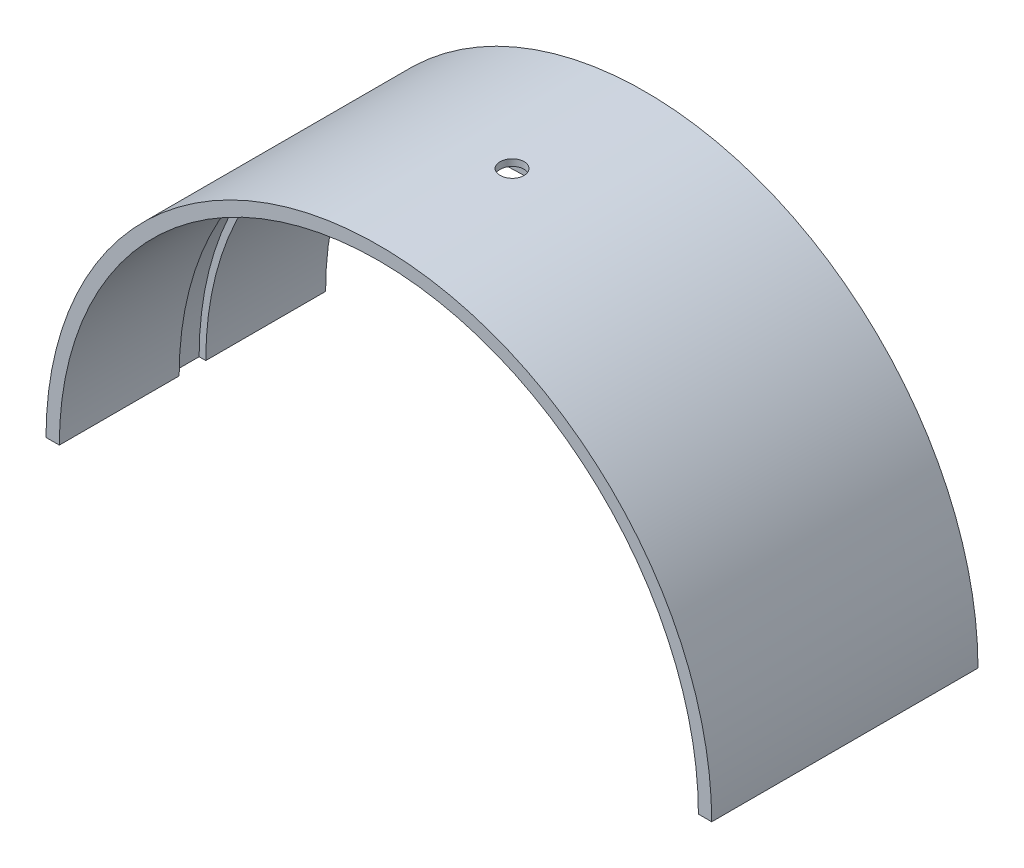
ISO-10303-21;
HEADER;
FILE_DESCRIPTION(('STEP AP214'),'2;1');
FILE_NAME('part.step','',(''),(''),'','','');
FILE_SCHEMA(('AUTOMOTIVE_DESIGN { 1 0 10303 214 1 1 1 1 }'));
ENDSEC;
DATA;
#1=APPLICATION_CONTEXT('core data for automotive mechanical design processes');
#2=APPLICATION_PROTOCOL_DEFINITION('international standard','automotive_design',2000,#1);
#3=PRODUCT_CONTEXT('',#1,'mechanical');
#4=PRODUCT('Part','Part','',(#3));
#5=PRODUCT_RELATED_PRODUCT_CATEGORY('part','',(#4));
#6=PRODUCT_DEFINITION_FORMATION('','',#4);
#7=PRODUCT_DEFINITION_CONTEXT('part definition',#1,'design');
#8=PRODUCT_DEFINITION('design','',#6,#7);
#9=PRODUCT_DEFINITION_SHAPE('','',#8);
#10=(LENGTH_UNIT() NAMED_UNIT(*) SI_UNIT(.MILLI.,.METRE.));
#11=(NAMED_UNIT(*) PLANE_ANGLE_UNIT() SI_UNIT($,.RADIAN.));
#12=(NAMED_UNIT(*) SI_UNIT($,.STERADIAN.) SOLID_ANGLE_UNIT());
#13=UNCERTAINTY_MEASURE_WITH_UNIT(LENGTH_MEASURE(1.E-05),#10,'distance_accuracy_value','');
#14=(GEOMETRIC_REPRESENTATION_CONTEXT(3) GLOBAL_UNCERTAINTY_ASSIGNED_CONTEXT((#13)) GLOBAL_UNIT_ASSIGNED_CONTEXT((#10,
#11,#12)) REPRESENTATION_CONTEXT('',''));
#15=CARTESIAN_POINT('',(0.,0.,0.));
#16=DIRECTION('',(0.,0.,1.));
#17=DIRECTION('',(1.,0.,0.));
#18=AXIS2_PLACEMENT_3D('',#15,#16,#17);
#19=CARTESIAN_POINT('',(0.,0.,-11.5257567109553));
#20=DIRECTION('',(0.,0.,-1.));
#21=DIRECTION('',(-1.,0.,0.));
#22=AXIS2_PLACEMENT_3D('',#19,#20,#21);
#23=CYLINDRICAL_SURFACE('',#22,24.5);
#24=CARTESIAN_POINT('',(0.,0.,0.999999999999997));
#25=DIRECTION('',(0.,0.,-1.));
#26=DIRECTION('',(-1.,0.,0.));
#27=AXIS2_PLACEMENT_3D('',#24,#25,#26);
#28=CIRCLE('',#27,24.5);
#29=CARTESIAN_POINT('',(-24.5,-1.71082585603314E-13,0.999999999999997));
#30=VERTEX_POINT('',#29);
#31=CARTESIAN_POINT('',(24.5,0.,0.999999999999997));
#32=VERTEX_POINT('',#31);
#33=EDGE_CURVE('E53',#30,#32,#28,.T.);
#34=ORIENTED_EDGE('',*,*,#33,.F.);
#35=DIRECTION('',(0.,0.,-1.));
#36=VECTOR('',#35,1.);
#37=CARTESIAN_POINT('',(-24.5,-1.71082585603314E-13,0.));
#38=LINE('',#37,#36);
#39=CARTESIAN_POINT('',(-24.5,-1.71082585603314E-13,-1.));
#40=VERTEX_POINT('',#39);
#41=EDGE_CURVE('E155',#30,#40,#38,.T.);
#42=ORIENTED_EDGE('',*,*,#41,.T.);
#43=CARTESIAN_POINT('',(0.,0.,-1.));
#44=DIRECTION('',(0.,0.,-1.));
#45=DIRECTION('',(-1.,0.,0.));
#46=AXIS2_PLACEMENT_3D('',#43,#44,#45);
#47=CIRCLE('',#46,24.5);
#48=CARTESIAN_POINT('',(24.5,0.,-1.));
#49=VERTEX_POINT('',#48);
#50=EDGE_CURVE('E60',#40,#49,#47,.T.);
#51=ORIENTED_EDGE('',*,*,#50,.T.);
#52=DIRECTION('',(0.,0.,-1.));
#53=VECTOR('',#52,1.);
#54=CARTESIAN_POINT('',(24.5,0.,0.));
#55=LINE('',#54,#53);
#56=EDGE_CURVE('E123',#32,#49,#55,.T.);
#57=ORIENTED_EDGE('',*,*,#56,.F.);
#58=EDGE_LOOP('',(#34,#42,#51,#57));
#59=FACE_BOUND('',#58,.T.);
#60=CARTESIAN_POINT('',(0.,24.5,-0.9));
#61=CARTESIAN_POINT('',(-0.0505351060782391,24.4999997777193,-0.899997764618985));
#62=CARTESIAN_POINT('',(-0.101106420724203,24.4998419685368,-0.895729382512844));
#63=CARTESIAN_POINT('',(-0.200855035460117,24.499227607288,-0.878761893636397));
#64=CARTESIAN_POINT('',(-0.250030604068245,24.4987706997461,-0.866052754840935));
#65=CARTESIAN_POINT('',(-0.345528266124883,24.4976098771127,-0.832567165531731));
#66=CARTESIAN_POINT('',(-0.391851758754188,24.4969060842924,-0.811794707878773));
#67=CARTESIAN_POINT('',(-0.480341370296564,24.4953308430445,-0.762777978781651));
#68=CARTESIAN_POINT('',(-0.522508491280468,24.4944594351779,-0.734535514379406));
#69=CARTESIAN_POINT('',(-0.601527041724291,24.4926464614145,-0.671360684171487));
#70=CARTESIAN_POINT('',(-0.638375665502354,24.491704858882,-0.636424809824677));
#71=CARTESIAN_POINT('',(-0.705687480975214,24.4898579404172,-0.560861395845723));
#72=CARTESIAN_POINT('',(-0.736150416552575,24.4889526259416,-0.52023362803188));
#73=CARTESIAN_POINT('',(-0.789832073100561,24.4872801553044,-0.434427275868664));
#74=CARTESIAN_POINT('',(-0.81304887440522,24.4865130357765,-0.389247489772304));
#75=CARTESIAN_POINT('',(-0.851566823368687,24.4852038483768,-0.295628103839328));
#76=CARTESIAN_POINT('',(-0.866868010713494,24.4846617793767,-0.247188520347521));
#77=CARTESIAN_POINT('',(-0.889113712393846,24.4838641141696,-0.148447914584213));
#78=CARTESIAN_POINT('',(-0.896062027972267,24.4836083876569,-0.0981477497807842));
#79=CARTESIAN_POINT('',(-0.901416467016089,24.4834118511139,0.00290563695993807));
#80=CARTESIAN_POINT('',(-0.899822633931691,24.4834710394818,0.0536588565914271));
#81=CARTESIAN_POINT('',(-0.888141209918508,24.4838975368855,0.154151859365249));
#82=CARTESIAN_POINT('',(-0.878057725236362,24.4842646969622,0.203892120542047));
#83=CARTESIAN_POINT('',(-0.849689587459662,24.4852655154777,0.300973429353913));
#84=CARTESIAN_POINT('',(-0.83140491163499,24.4858991746551,0.348314470338986));
#85=CARTESIAN_POINT('',(-0.787148718762686,24.4873617351961,0.43926672908332));
#86=CARTESIAN_POINT('',(-0.761175322276081,24.4881906842865,0.482877031533373));
#87=CARTESIAN_POINT('',(-0.702280362135567,24.4899503325209,0.565119848120088));
#88=CARTESIAN_POINT('',(-0.669358773284214,24.490881032034,0.603752344204044));
#89=CARTESIAN_POINT('',(-0.597478740517276,24.4927399316147,0.674966825318465));
#90=CARTESIAN_POINT('',(-0.558516737859195,24.4936681298786,0.707545218502961));
#91=CARTESIAN_POINT('',(-0.475674405472432,24.4954168654581,0.7656990514857));
#92=CARTESIAN_POINT('',(-0.431794074848379,24.4962374027542,0.791274490009069));
#93=CARTESIAN_POINT('',(-0.340358662170344,24.4976783434958,0.834696035773812));
#94=CARTESIAN_POINT('',(-0.292803524755661,24.4982987439255,0.85254202654485));
#95=CARTESIAN_POINT('',(-0.195369323657861,24.4992694331828,0.879995785473122));
#96=CARTESIAN_POINT('',(-0.145490269410039,24.4996197231071,0.889603587075014));
#97=CARTESIAN_POINT('',(-0.0448553230308331,24.5000105668965,0.90030382849252));
#98=CARTESIAN_POINT('',(0.00590004003000969,24.5000513015234,0.90140123787227));
#99=CARTESIAN_POINT('',(0.106874255094776,24.4998189223698,0.895062499128601));
#100=CARTESIAN_POINT('',(0.157093108043517,24.499545809142,0.887626366035625));
#101=CARTESIAN_POINT('',(0.25555489779959,24.4987166255881,0.864435740013489));
#102=CARTESIAN_POINT('',(0.303798367607939,24.4981606321401,0.848683507098701));
#103=CARTESIAN_POINT('',(0.396956315781612,24.4968283246329,0.809310121872092));
#104=CARTESIAN_POINT('',(0.441870783933728,24.496052009898,0.785688945419976));
#105=CARTESIAN_POINT('',(0.527118630317461,24.4943660278986,0.731235415126712));
#106=CARTESIAN_POINT('',(0.567449873222022,24.4934562989249,0.700399720335924));
#107=CARTESIAN_POINT('',(0.642364960123,24.4916062004816,0.632397364376701));
#108=CARTESIAN_POINT('',(0.676948783226594,24.4906658309007,0.595230680195063));
#109=CARTESIAN_POINT('',(0.739403957700735,24.4888599417767,0.515600051209842));
#110=CARTESIAN_POINT('',(0.767272100258646,24.4879944581409,0.473133588775546));
#111=CARTESIAN_POINT('',(0.815482908665854,24.4864364888819,0.384121671765032));
#112=CARTESIAN_POINT('',(0.835825595932535,24.4857440027664,0.337576228798025));
#113=CARTESIAN_POINT('',(0.868402421095069,24.4846103645958,0.241739631634666));
#114=CARTESIAN_POINT('',(0.880638626446128,24.4841691484615,0.192449180996761));
#115=CARTESIAN_POINT('',(0.896661918695542,24.4835876183772,0.0925118202634302));
#116=CARTESIAN_POINT('',(0.900449024383912,24.483447303758,0.0418649131848911));
#117=CARTESIAN_POINT('',(0.899466382713747,24.4834834202253,-0.0593156486842136));
#118=CARTESIAN_POINT('',(0.894701690063422,24.4836596642037,-0.109849352710204));
#119=CARTESIAN_POINT('',(0.876761119269286,24.4843086367024,-0.209399006958379));
#120=CARTESIAN_POINT('',(0.863585224604651,24.484781365805,-0.25841495419927));
#121=CARTESIAN_POINT('',(0.829197121319196,24.485969985683,-0.353539234715138));
#122=CARTESIAN_POINT('',(0.807984793438202,24.486685880067,-0.399647524828818));
#123=CARTESIAN_POINT('',(0.758127255735359,24.4882801031161,-0.487647831542547));
#124=CARTESIAN_POINT('',(0.729482303233341,24.4891584261576,-0.529539994036608));
#125=CARTESIAN_POINT('',(0.665556073380793,24.4909790575738,-0.607943161223141));
#126=CARTESIAN_POINT('',(0.630271590846078,24.4919213967107,-0.64445155169295));
#127=CARTESIAN_POINT('',(0.554064051327019,24.4937637478822,-0.711036953101924));
#128=CARTESIAN_POINT('',(0.513139602892659,24.4946637493979,-0.741112372259305));
#129=CARTESIAN_POINT('',(0.426793327767193,24.4963203812061,-0.793985699171462));
#130=CARTESIAN_POINT('',(0.381368219856142,24.4970769057078,-0.816778245411689));
#131=CARTESIAN_POINT('',(0.287368054038592,24.498359532988,-0.85438655980945));
#132=CARTESIAN_POINT('',(0.23879681986582,24.4988859096665,-0.869211814722354));
#133=CARTESIAN_POINT('',(0.158266803914834,24.4995086559252,-0.886547131982897));
#134=CARTESIAN_POINT('',(0.126830430064505,24.4996921076025,-0.891585583730774));
#135=CARTESIAN_POINT('',(0.0636008188793678,24.4999378495662,-0.898312720482534));
#136=CARTESIAN_POINT('',(0.0318075817040646,24.5000001399069,-0.900001406983576));
#137=CARTESIAN_POINT('',(0.,24.5,-0.9));
#138=B_SPLINE_CURVE_WITH_KNOTS('',3,(#60,#61,#62,#63,#64,#65,#66,#67,#68,#69,#70,#71,#72,#73,
#74,#75,#76,#77,#78,#79,#80,#81,#82,#83,#84,#85,#86,#87,#88,#89,#90,#91,#92,#93,#94,#95,#96,#97,
#98,#99,#100,#101,#102,#103,#104,#105,#106,#107,#108,#109,#110,#111,#112,#113,#114,#115,#116,
#117,#118,#119,#120,#121,#122,#123,#124,#125,#126,#127,#128,#129,#130,#131,#132,#133,#134,#135,
#136,#137),.UNSPECIFIED.,.T.,.F.,(4,2,2,2,2,2,2,2,2,2,2,2,2,2,2,2,2,2,2,2,2,2,2,2,2,2,2,2,2,2,2,
2,2,2,2,2,2,2,4),(0.,0.151489214279059,0.303158799800879,0.454753375939524,0.606311313877182,
0.757948913650054,0.909592594146601,1.06127641447353,1.21295947430577,1.36457347972142,
1.51618671394318,1.66772665847641,1.81926702301472,1.97084446087038,2.12242244842719,
2.27409008074402,2.42575774067162,2.57742768590722,2.72909701540396,2.88067777233702,
3.03225826228573,3.18379757934336,3.33533736129664,3.48694745873902,3.6385581072972,
3.79024105378945,3.94192356858998,4.09356738378506,4.24521086173798,4.39676473735314,
4.54831891064307,4.69987533307567,4.85142650927658,5.00305103425648,5.15471303409084,
5.30648642877394,5.45807870226744,5.55342841236032,5.64877807983714),.UNSPECIFIED.);
#139=CARTESIAN_POINT('',(0.,24.5,-0.9));
#140=VERTEX_POINT('',#139);
#141=EDGE_CURVE('E128',#140,#140,#138,.T.);
#142=ORIENTED_EDGE('',*,*,#141,.T.);
#143=EDGE_LOOP('',(#142));
#144=FACE_BOUND('',#143,.T.);
#145=ADVANCED_FACE('F39',(#59,#144),#23,.F.);
#146=CARTESIAN_POINT('',(0.,0.,-11.5257567109553));
#147=DIRECTION('',(0.,0.,-1.));
#148=DIRECTION('',(-1.,0.,0.));
#149=AXIS2_PLACEMENT_3D('',#146,#147,#148);
#150=CYLINDRICAL_SURFACE('',#149,25.);
#151=CARTESIAN_POINT('',(0.,0.,-10.));
#152=DIRECTION('',(0.,0.,-1.));
#153=DIRECTION('',(-1.,0.,0.));
#154=AXIS2_PLACEMENT_3D('',#151,#152,#153);
#155=CIRCLE('',#154,25.);
#156=CARTESIAN_POINT('',(-25.,-1.74574066942157E-13,-10.));
#157=VERTEX_POINT('',#156);
#158=CARTESIAN_POINT('',(25.,0.,-10.));
#159=VERTEX_POINT('',#158);
#160=EDGE_CURVE('E188',#157,#159,#155,.T.);
#161=ORIENTED_EDGE('',*,*,#160,.F.);
#162=DIRECTION('',(0.,0.,1.));
#163=VECTOR('',#162,1.);
#164=CARTESIAN_POINT('',(-25.,-1.74574066942157E-13,0.));
#165=LINE('',#164,#163);
#166=CARTESIAN_POINT('',(-25.,-1.74574066942157E-13,10.));
#167=VERTEX_POINT('',#166);
#168=EDGE_CURVE('E169',#157,#167,#165,.T.);
#169=ORIENTED_EDGE('',*,*,#168,.T.);
#170=CARTESIAN_POINT('',(0.,0.,10.));
#171=DIRECTION('',(0.,0.,-1.));
#172=DIRECTION('',(-1.,0.,0.));
#173=AXIS2_PLACEMENT_3D('',#170,#171,#172);
#174=CIRCLE('',#173,25.);
#175=CARTESIAN_POINT('',(25.,0.,10.));
#176=VERTEX_POINT('',#175);
#177=EDGE_CURVE('E191',#167,#176,#174,.T.);
#178=ORIENTED_EDGE('',*,*,#177,.T.);
#179=DIRECTION('',(0.,0.,1.));
#180=VECTOR('',#179,1.);
#181=CARTESIAN_POINT('',(25.,0.,0.));
#182=LINE('',#181,#180);
#183=EDGE_CURVE('E144',#159,#176,#182,.T.);
#184=ORIENTED_EDGE('',*,*,#183,.F.);
#185=EDGE_LOOP('',(#161,#169,#178,#184));
#186=FACE_BOUND('',#185,.T.);
#187=CARTESIAN_POINT('',(0.,25.,-0.9));
#188=CARTESIAN_POINT('',(0.0505358299575111,24.9999997821146,-0.899997764357591));
#189=CARTESIAN_POINT('',(0.101107886204852,24.9998451246391,-0.895729260451866));
#190=CARTESIAN_POINT('',(0.200858013351447,24.9992430331769,-0.878761259574586));
#191=CARTESIAN_POINT('',(0.250034351978575,24.998795250655,-0.866051725676573));
#192=CARTESIAN_POINT('',(0.345533557905941,24.9976576121728,-0.832565025231658));
#193=CARTESIAN_POINT('',(0.39185782247057,24.996967875876,-0.811791846189618));
#194=CARTESIAN_POINT('',(0.480348825067873,24.9954241009306,-0.76277335218435));
#195=CARTESIAN_POINT('',(0.522516566319998,24.9945701020761,-0.734529846352528));
#196=CARTESIAN_POINT('',(0.601535420471143,24.992793372449,-0.671353196972493));
#197=CARTESIAN_POINT('',(0.638383816447172,24.9918706069153,-0.636416655921973));
#198=CARTESIAN_POINT('',(0.705695009782056,24.9900606494127,-0.560851947562661));
#199=CARTESIAN_POINT('',(0.73615755123268,24.9891734588706,-0.520223552265973));
#200=CARTESIAN_POINT('',(0.789837938182272,24.9875344936121,-0.434416571778399));
#201=CARTESIAN_POINT('',(0.813053945584977,24.9867827532734,-0.389236835969661));
#202=CARTESIAN_POINT('',(0.851570367321573,24.9854998231692,-0.295617817866157));
#203=CARTESIAN_POINT('',(0.866870820397095,24.9849686323244,-0.247178551526045));
#204=CARTESIAN_POINT('',(0.889115403017304,24.9841869777321,-0.148437908786091));
#205=CARTESIAN_POINT('',(0.896063182768704,24.9839363913608,-0.0981373557018038));
#206=CARTESIAN_POINT('',(0.901416448483106,24.9837438327537,0.00291668969367428));
#207=CARTESIAN_POINT('',(0.899821976784824,24.9838018589883,0.0536701797586883));
#208=CARTESIAN_POINT('',(0.888139067220623,24.9842198679703,0.154164624005448));
#209=CARTESIAN_POINT('',(0.878054572670543,24.9845797105345,0.20390603727822));
#210=CARTESIAN_POINT('',(0.8496839828355,24.9855605683101,0.300989480445962));
#211=CARTESIAN_POINT('',(0.831397865374745,24.9861815842279,0.348331503853006));
#212=CARTESIAN_POINT('',(0.787138584095716,24.9876149471606,0.439285003008272));
#213=CARTESIAN_POINT('',(0.761163615103002,24.9884273390974,0.482895599596076));
#214=CARTESIAN_POINT('',(0.702265296005424,24.9901518306294,0.565138666128165));
#215=CARTESIAN_POINT('',(0.66934192181051,24.9910639305703,0.603771118812526));
#216=CARTESIAN_POINT('',(0.597459074243739,24.9928856456015,0.674984228080218));
#217=CARTESIAN_POINT('',(0.558496183141841,24.9937952589862,0.707561434934492));
#218=CARTESIAN_POINT('',(0.475652359994273,24.9955089649375,0.765712738710541));
#219=CARTESIAN_POINT('',(0.431771427065669,24.9963130574851,0.791286834375047));
#220=CARTESIAN_POINT('',(0.340335197237805,24.9977251006856,0.834705588948888));
#221=CARTESIAN_POINT('',(0.29277984736518,24.9983330485101,0.852550136398293));
#222=CARTESIAN_POINT('',(0.195345578500072,24.9992842304056,0.880001037052016));
#223=CARTESIAN_POINT('',(0.14546666857177,24.9996274655093,0.889607422390469));
#224=CARTESIAN_POINT('',(0.0448311307414574,25.0000104006701,0.900305075016805));
#225=CARTESIAN_POINT('',(-0.00592498917054738,25.0000502708673,0.901401115281439));
#226=CARTESIAN_POINT('',(-0.106900491218682,24.9998224330805,0.895059407795804));
#227=CARTESIAN_POINT('',(-0.157119874261571,24.9995547256163,0.887621674464737));
#228=CARTESIAN_POINT('',(-0.25558303287527,24.9987420084713,0.864427500246508));
#229=CARTESIAN_POINT('',(-0.303827320309746,24.998197071135,0.848673229559171));
#230=CARTESIAN_POINT('',(-0.396986537117233,24.9968912870011,0.809295388128882));
#231=CARTESIAN_POINT('',(-0.441901456694551,24.9961304395681,0.78567179423387));
#232=CARTESIAN_POINT('',(-0.527148923451362,24.9944780920711,0.731213620439007));
#233=CARTESIAN_POINT('',(-0.567479419373229,24.9935865339271,0.700375831339088));
#234=CARTESIAN_POINT('',(-0.642392596182118,24.9917734198405,0.632369345345544));
#235=CARTESIAN_POINT('',(-0.676975256913769,24.9908518637927,0.595200626252792));
#236=CARTESIAN_POINT('',(-0.739427060525725,24.9890821545523,0.515566890230258));
#237=CARTESIAN_POINT('',(-0.767293121780838,24.9882340351669,0.47309945572053));
#238=CARTESIAN_POINT('',(-0.815499648963938,24.9867073559729,0.384086081300572));
#239=CARTESIAN_POINT('',(-0.835840135779761,24.9860287956937,0.337540152710973));
#240=CARTESIAN_POINT('',(-0.868412726007746,24.9849179852326,0.24170261439681));
#241=CARTESIAN_POINT('',(-0.880646815933241,24.9844856747097,0.19241168056155));
#242=CARTESIAN_POINT('',(-0.89666583880174,24.9839159380231,0.0924737829478655));
#243=CARTESIAN_POINT('',(-0.900450789183601,24.9837785112507,0.0418268219684737));
#244=CARTESIAN_POINT('',(-0.899463868530838,24.9838140585843,-0.0593546784743515));
#245=CARTESIAN_POINT('',(-0.894696852396149,24.9839868565775,-0.109889265426613));
#246=CARTESIAN_POINT('',(-0.876751318545876,24.9846230038243,-0.209440309881037));
#247=CARTESIAN_POINT('',(-0.863572784289526,24.9850863536493,-0.25845676439768));
#248=CARTESIAN_POINT('',(-0.829179113282818,24.9862513412054,-0.35358164392861));
#249=CARTESIAN_POINT('',(-0.807963855236856,24.9869529825331,-0.399690025040058));
#250=CARTESIAN_POINT('',(-0.758100236851855,24.9885154321198,-0.487689972185059));
#251=CARTESIAN_POINT('',(-0.729452135203476,24.9893762348391,-0.529581684903974));
#252=CARTESIAN_POINT('',(-0.665520265833703,24.9911604969519,-0.607982379669272));
#253=CARTESIAN_POINT('',(-0.630233447226496,24.992083985028,-0.644488873070192));
#254=CARTESIAN_POINT('',(-0.554021581378666,24.9938894477835,-0.711070062268238));
#255=CARTESIAN_POINT('',(-0.51309514246935,24.994771412144,-0.741143165831196));
#256=CARTESIAN_POINT('',(-0.426745822875752,24.9963947970882,-0.794011211698385));
#257=CARTESIAN_POINT('',(-0.381319707298787,24.9971361154264,-0.816800867329719));
#258=CARTESIAN_POINT('',(-0.287318176228993,24.9983929187085,-0.854403306596549));
#259=CARTESIAN_POINT('',(-0.238746584932446,24.9989086721837,-0.869225580111627));
#260=CARTESIAN_POINT('',(-0.158224503224093,24.9995187407918,-0.886554375601815));
#261=CARTESIAN_POINT('',(-0.12679640493848,24.999698427448,-0.891590117517155));
#262=CARTESIAN_POINT('',(-0.0635836521312206,24.9999391255774,-0.898313632372805));
#263=CARTESIAN_POINT('',(-0.0317989977624168,25.0000001371015,-0.900001406748203));
#264=CARTESIAN_POINT('',(0.,25.,-0.9));
#265=B_SPLINE_CURVE_WITH_KNOTS('',3,(#187,#188,#189,#190,#191,#192,#193,#194,#195,#196,#197,
#198,#199,#200,#201,#202,#203,#204,#205,#206,#207,#208,#209,#210,#211,#212,#213,#214,#215,#216,
#217,#218,#219,#220,#221,#222,#223,#224,#225,#226,#227,#228,#229,#230,#231,#232,#233,#234,#235,
#236,#237,#238,#239,#240,#241,#242,#243,#244,#245,#246,#247,#248,#249,#250,#251,#252,#253,#254,
#255,#256,#257,#258,#259,#260,#261,#262,#263,#264),.UNSPECIFIED.,.T.,.F.,(4,2,2,2,2,2,2,2,2,2,2,
2,2,2,2,2,2,2,2,2,2,2,2,2,2,2,2,2,2,2,2,2,2,2,2,2,2,2,4),(0.,0.151491417505849,
0.303163291306592,0.454760258108646,0.606320545375005,0.757957972141804,0.909601474501192,
1.06128341030584,1.21296460371633,1.36457948671512,1.51619361825238,1.66773736920404,
1.81928152990669,1.97086129812668,2.12244159188085,2.27410797939034,2.42577439412844,
2.57744299582035,2.72911100590436,2.8806939477326,3.03227663343709,3.18381978318972,
3.33536337879607,3.48697451646394,3.63858618576051,3.79026728375719,3.94194796074764,
4.09359145386488,4.24523463399265,4.39679175443925,4.54834917291511,4.69990887888794,
4.85146331072557,5.00308756173752,5.15474929574461,5.30652086434365,5.45811125630726,
5.55343525346421,5.64875920976104),.UNSPECIFIED.);
#266=CARTESIAN_POINT('',(0.,25.,-0.9));
#267=VERTEX_POINT('',#266);
#268=EDGE_CURVE('E11',#267,#267,#265,.T.);
#269=ORIENTED_EDGE('',*,*,#268,.T.);
#270=EDGE_LOOP('',(#269));
#271=FACE_BOUND('',#270,.T.);
#272=ADVANCED_FACE('F216',(#186,#271),#150,.T.);
#273=CARTESIAN_POINT('',(0.,0.,0.999999999999997));
#274=DIRECTION('',(0.,0.,-1.));
#275=DIRECTION('',(-1.,0.,0.));
#276=AXIS2_PLACEMENT_3D('',#273,#274,#275);
#277=PLANE('',#276);
#278=CARTESIAN_POINT('',(0.,0.,0.999999999999996));
#279=DIRECTION('',(0.,0.,-1.));
#280=DIRECTION('',(-1.,0.,0.));
#281=AXIS2_PLACEMENT_3D('',#278,#279,#280);
#282=CIRCLE('',#281,24.);
#283=CARTESIAN_POINT('',(-24.,-1.6759110426447E-13,0.999999999999996));
#284=VERTEX_POINT('',#283);
#285=CARTESIAN_POINT('',(24.,0.,0.999999999999996));
#286=VERTEX_POINT('',#285);
#287=EDGE_CURVE('E121',#284,#286,#282,.T.);
#288=ORIENTED_EDGE('',*,*,#287,.F.);
#289=DIRECTION('',(-1.,0.,0.));
#290=VECTOR('',#289,1.);
#291=CARTESIAN_POINT('',(0.,0.,0.999999999999923));
#292=LINE('',#291,#290);
#293=EDGE_CURVE('E117',#284,#30,#292,.T.);
#294=ORIENTED_EDGE('',*,*,#293,.T.);
#295=ORIENTED_EDGE('',*,*,#33,.T.);
#296=DIRECTION('',(1.,0.,0.));
#297=VECTOR('',#296,1.);
#298=CARTESIAN_POINT('',(0.,0.,0.999999999999923));
#299=LINE('',#298,#297);
#300=EDGE_CURVE('E114',#286,#32,#299,.T.);
#301=ORIENTED_EDGE('',*,*,#300,.F.);
#302=EDGE_LOOP('',(#288,#294,#295,#301));
#303=FACE_BOUND('',#302,.T.);
#304=ADVANCED_FACE('F41',(#303),#277,.T.);
#305=CARTESIAN_POINT('',(0.,0.,-11.5257567109553));
#306=DIRECTION('',(0.,0.,-1.));
#307=DIRECTION('',(-1.,0.,0.));
#308=AXIS2_PLACEMENT_3D('',#305,#306,#307);
#309=CYLINDRICAL_SURFACE('',#308,24.);
#310=CARTESIAN_POINT('',(0.,0.,10.));
#311=DIRECTION('',(0.,0.,-1.));
#312=DIRECTION('',(-1.,0.,0.));
#313=AXIS2_PLACEMENT_3D('',#310,#311,#312);
#314=CIRCLE('',#313,24.);
#315=CARTESIAN_POINT('',(-24.,-1.6759110426447E-13,10.));
#316=VERTEX_POINT('',#315);
#317=CARTESIAN_POINT('',(24.,0.,10.));
#318=VERTEX_POINT('',#317);
#319=EDGE_CURVE('E194',#316,#318,#314,.T.);
#320=ORIENTED_EDGE('',*,*,#319,.F.);
#321=DIRECTION('',(0.,0.,-1.));
#322=VECTOR('',#321,1.);
#323=CARTESIAN_POINT('',(-24.,-1.6759110426447E-13,0.));
#324=LINE('',#323,#322);
#325=EDGE_CURVE('E160',#316,#284,#324,.T.);
#326=ORIENTED_EDGE('',*,*,#325,.T.);
#327=ORIENTED_EDGE('',*,*,#287,.T.);
#328=DIRECTION('',(0.,0.,-1.));
#329=VECTOR('',#328,1.);
#330=CARTESIAN_POINT('',(24.,0.,0.));
#331=LINE('',#330,#329);
#332=EDGE_CURVE('E133',#318,#286,#331,.T.);
#333=ORIENTED_EDGE('',*,*,#332,.F.);
#334=EDGE_LOOP('',(#320,#326,#327,#333));
#335=FACE_BOUND('',#334,.T.);
#336=ADVANCED_FACE('F199',(#335),#309,.F.);
#337=CARTESIAN_POINT('',(0.,0.,10.));
#338=DIRECTION('',(0.,0.,1.));
#339=DIRECTION('',(1.,0.,0.));
#340=AXIS2_PLACEMENT_3D('',#337,#338,#339);
#341=PLANE('',#340);
#342=ORIENTED_EDGE('',*,*,#177,.F.);
#343=DIRECTION('',(1.,0.,0.));
#344=VECTOR('',#343,1.);
#345=CARTESIAN_POINT('',(0.,0.,10.));
#346=LINE('',#345,#344);
#347=EDGE_CURVE('E164',#167,#316,#346,.T.);
#348=ORIENTED_EDGE('',*,*,#347,.T.);
#349=ORIENTED_EDGE('',*,*,#319,.T.);
#350=DIRECTION('',(-1.,0.,0.));
#351=VECTOR('',#350,1.);
#352=CARTESIAN_POINT('',(0.,0.,10.));
#353=LINE('',#352,#351);
#354=EDGE_CURVE('E137',#176,#318,#353,.T.);
#355=ORIENTED_EDGE('',*,*,#354,.F.);
#356=EDGE_LOOP('',(#342,#348,#349,#355));
#357=FACE_BOUND('',#356,.T.);
#358=ADVANCED_FACE('F220',(#357),#341,.T.);
#359=CARTESIAN_POINT('',(0.,0.,-10.));
#360=DIRECTION('',(0.,0.,-1.));
#361=DIRECTION('',(-1.,0.,0.));
#362=AXIS2_PLACEMENT_3D('',#359,#360,#361);
#363=PLANE('',#362);
#364=CARTESIAN_POINT('',(0.,0.,-10.));
#365=DIRECTION('',(0.,0.,-1.));
#366=DIRECTION('',(-1.,0.,0.));
#367=AXIS2_PLACEMENT_3D('',#364,#365,#366);
#368=CIRCLE('',#367,24.);
#369=CARTESIAN_POINT('',(-24.,-1.6759110426447E-13,-10.));
#370=VERTEX_POINT('',#369);
#371=CARTESIAN_POINT('',(24.,0.,-10.));
#372=VERTEX_POINT('',#371);
#373=EDGE_CURVE('E185',#370,#372,#368,.T.);
#374=ORIENTED_EDGE('',*,*,#373,.F.);
#375=DIRECTION('',(-1.,0.,0.));
#376=VECTOR('',#375,1.);
#377=CARTESIAN_POINT('',(0.,0.,-10.));
#378=LINE('',#377,#376);
#379=EDGE_CURVE('E173',#370,#157,#378,.T.);
#380=ORIENTED_EDGE('',*,*,#379,.T.);
#381=ORIENTED_EDGE('',*,*,#160,.T.);
#382=DIRECTION('',(1.,0.,0.));
#383=VECTOR('',#382,1.);
#384=CARTESIAN_POINT('',(0.,0.,-10.));
#385=LINE('',#384,#383);
#386=EDGE_CURVE('E148',#372,#159,#385,.T.);
#387=ORIENTED_EDGE('',*,*,#386,.F.);
#388=EDGE_LOOP('',(#374,#380,#381,#387));
#389=FACE_BOUND('',#388,.T.);
#390=ADVANCED_FACE('F213',(#389),#363,.T.);
#391=CARTESIAN_POINT('',(0.,0.,-1.));
#392=DIRECTION('',(0.,0.,-1.));
#393=DIRECTION('',(-1.,0.,0.));
#394=AXIS2_PLACEMENT_3D('',#391,#392,#393);
#395=CIRCLE('',#394,24.);
#396=CARTESIAN_POINT('',(-24.,-1.6759110426447E-13,-1.));
#397=VERTEX_POINT('',#396);
#398=CARTESIAN_POINT('',(24.,0.,-1.));
#399=VERTEX_POINT('',#398);
#400=EDGE_CURVE('E68',#397,#399,#395,.T.);
#401=ORIENTED_EDGE('',*,*,#400,.F.);
#402=EDGE_CURVE('E165',#397,#370,#324,.T.);
#403=ORIENTED_EDGE('',*,*,#402,.T.);
#404=ORIENTED_EDGE('',*,*,#373,.T.);
#405=EDGE_CURVE('E139',#399,#372,#331,.T.);
#406=ORIENTED_EDGE('',*,*,#405,.F.);
#407=EDGE_LOOP('',(#401,#403,#404,#406));
#408=FACE_BOUND('',#407,.T.);
#409=ADVANCED_FACE('F207',(#408),#309,.F.);
#410=CARTESIAN_POINT('',(0.,0.,-1.));
#411=DIRECTION('',(0.,0.,-1.));
#412=DIRECTION('',(-1.,0.,0.));
#413=AXIS2_PLACEMENT_3D('',#410,#411,#412);
#414=PLANE('',#413);
#415=DIRECTION('',(-1.,0.,0.));
#416=VECTOR('',#415,1.);
#417=CARTESIAN_POINT('',(0.,0.,-1.00000000000006));
#418=LINE('',#417,#416);
#419=EDGE_CURVE('E177',#397,#40,#418,.T.);
#420=ORIENTED_EDGE('',*,*,#419,.F.);
#421=ORIENTED_EDGE('',*,*,#400,.T.);
#422=DIRECTION('',(1.,0.,0.));
#423=VECTOR('',#422,1.);
#424=CARTESIAN_POINT('',(0.,0.,-1.00000000000006));
#425=LINE('',#424,#423);
#426=EDGE_CURVE('E152',#399,#49,#425,.T.);
#427=ORIENTED_EDGE('',*,*,#426,.T.);
#428=ORIENTED_EDGE('',*,*,#50,.F.);
#429=EDGE_LOOP('',(#420,#421,#427,#428));
#430=FACE_BOUND('',#429,.T.);
#431=ADVANCED_FACE('F205',(#430),#414,.F.);
#432=CARTESIAN_POINT('',(0.,0.,0.));
#433=DIRECTION('',(0.,-1.,0.));
#434=DIRECTION('',(0.,0.,1.));
#435=AXIS2_PLACEMENT_3D('',#432,#433,#434);
#436=PLANE('',#435);
#437=ORIENTED_EDGE('',*,*,#41,.F.);
#438=ORIENTED_EDGE('',*,*,#293,.F.);
#439=ORIENTED_EDGE('',*,*,#325,.F.);
#440=ORIENTED_EDGE('',*,*,#347,.F.);
#441=ORIENTED_EDGE('',*,*,#168,.F.);
#442=ORIENTED_EDGE('',*,*,#379,.F.);
#443=ORIENTED_EDGE('',*,*,#402,.F.);
#444=ORIENTED_EDGE('',*,*,#419,.T.);
#445=EDGE_LOOP('',(#437,#438,#439,#440,#441,#442,#443,#444));
#446=FACE_BOUND('',#445,.T.);
#447=ADVANCED_FACE('F202',(#446),#436,.T.);
#448=CARTESIAN_POINT('',(0.,0.,0.));
#449=DIRECTION('',(0.,1.,0.));
#450=DIRECTION('',(0.,0.,1.));
#451=AXIS2_PLACEMENT_3D('',#448,#449,#450);
#452=PLANE('',#451);
#453=ORIENTED_EDGE('',*,*,#56,.T.);
#454=ORIENTED_EDGE('',*,*,#426,.F.);
#455=ORIENTED_EDGE('',*,*,#405,.T.);
#456=ORIENTED_EDGE('',*,*,#386,.T.);
#457=ORIENTED_EDGE('',*,*,#183,.T.);
#458=ORIENTED_EDGE('',*,*,#354,.T.);
#459=ORIENTED_EDGE('',*,*,#332,.T.);
#460=ORIENTED_EDGE('',*,*,#300,.T.);
#461=EDGE_LOOP('',(#453,#454,#455,#456,#457,#458,#459,#460));
#462=FACE_BOUND('',#461,.T.);
#463=ADVANCED_FACE('F130',(#462),#452,.F.);
#464=CARTESIAN_POINT('',(0.,25.,0.));
#465=DIRECTION('',(0.,-1.,0.));
#466=DIRECTION('',(0.,0.,-1.));
#467=AXIS2_PLACEMENT_3D('',#464,#465,#466);
#468=CYLINDRICAL_SURFACE('',#467,0.9);
#469=ORIENTED_EDGE('',*,*,#141,.F.);
#470=EDGE_LOOP('',(#469));
#471=FACE_BOUND('',#470,.T.);
#472=ORIENTED_EDGE('',*,*,#268,.F.);
#473=EDGE_LOOP('',(#472));
#474=FACE_BOUND('',#473,.T.);
#475=ADVANCED_FACE('F242',(#471,#474),#468,.F.);
#476=CLOSED_SHELL('',(#145,#272,#304,#336,#358,#390,#409,#431,#447,#463,#475));
#477=MANIFOLD_SOLID_BREP('B2',#476);
#478=ADVANCED_BREP_SHAPE_REPRESENTATION('',(#18,#477),#14);
#479=SHAPE_DEFINITION_REPRESENTATION(#9,#478);
ENDSEC;
END-ISO-10303-21;
